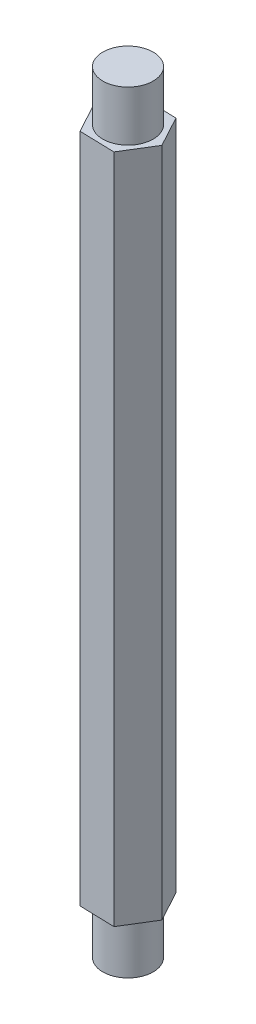
ISO-10303-21;
HEADER;
FILE_DESCRIPTION(('STEP AP214'),'2;1');
FILE_NAME('part.step','',(''),(''),'','','');
FILE_SCHEMA(('AUTOMOTIVE_DESIGN { 1 0 10303 214 1 1 1 1 }'));
ENDSEC;
DATA;
#1=APPLICATION_CONTEXT('core data for automotive mechanical design processes');
#2=APPLICATION_PROTOCOL_DEFINITION('international standard','automotive_design',2000,#1);
#3=PRODUCT_CONTEXT('',#1,'mechanical');
#4=PRODUCT('Part','Part','',(#3));
#5=PRODUCT_RELATED_PRODUCT_CATEGORY('part','',(#4));
#6=PRODUCT_DEFINITION_FORMATION('','',#4);
#7=PRODUCT_DEFINITION_CONTEXT('part definition',#1,'design');
#8=PRODUCT_DEFINITION('design','',#6,#7);
#9=PRODUCT_DEFINITION_SHAPE('','',#8);
#10=(LENGTH_UNIT() NAMED_UNIT(*) SI_UNIT(.MILLI.,.METRE.));
#11=(NAMED_UNIT(*) PLANE_ANGLE_UNIT() SI_UNIT($,.RADIAN.));
#12=(NAMED_UNIT(*) SI_UNIT($,.STERADIAN.) SOLID_ANGLE_UNIT());
#13=UNCERTAINTY_MEASURE_WITH_UNIT(LENGTH_MEASURE(1.E-05),#10,'distance_accuracy_value','');
#14=(GEOMETRIC_REPRESENTATION_CONTEXT(3) GLOBAL_UNCERTAINTY_ASSIGNED_CONTEXT((#13)) GLOBAL_UNIT_ASSIGNED_CONTEXT((#10,
#11,#12)) REPRESENTATION_CONTEXT('',''));
#15=CARTESIAN_POINT('',(0.,0.,0.));
#16=DIRECTION('',(0.,0.,1.));
#17=DIRECTION('',(1.,0.,0.));
#18=AXIS2_PLACEMENT_3D('',#15,#16,#17);
#19=CARTESIAN_POINT('',(0.,43.,0.));
#20=DIRECTION('',(0.,1.,0.));
#21=DIRECTION('',(0.,0.,1.));
#22=AXIS2_PLACEMENT_3D('',#19,#20,#21);
#23=PLANE('',#22);
#24=DIRECTION('',(-0.999619051100166,0.,-0.0275998673475779));
#25=VECTOR('',#24,1.);
#26=CARTESIAN_POINT('',(1.08851435205721,43.,-1.7706316684634));
#27=LINE('',#26,#25);
#28=CARTESIAN_POINT('',(1.08851435205721,43.,-1.7706316684634));
#29=VERTEX_POINT('',#28);
#30=CARTESIAN_POINT('',(-0.989154829605925,43.,-1.8279969154972));
#31=VERTEX_POINT('',#30);
#32=EDGE_CURVE('E130',#29,#31,#27,.T.);
#33=ORIENTED_EDGE('',*,*,#32,.T.);
#34=DIRECTION('',(-0.523711711814166,0.,0.85189555868585));
#35=VECTOR('',#34,1.);
#36=CARTESIAN_POINT('',(-0.989154829605925,43.,-1.8279969154972));
#37=LINE('',#36,#35);
#38=CARTESIAN_POINT('',(-2.07766918166313,43.,-0.0573652470337996));
#39=VERTEX_POINT('',#38);
#40=EDGE_CURVE('E88',#31,#39,#37,.T.);
#41=ORIENTED_EDGE('',*,*,#40,.T.);
#42=DIRECTION('',(0.475907339286,0.,0.879495426033427));
#43=VECTOR('',#42,1.);
#44=CARTESIAN_POINT('',(-2.07766918166313,43.,-0.0573652470337996));
#45=LINE('',#44,#43);
#46=CARTESIAN_POINT('',(-1.0885143520572,43.,1.7706316684634));
#47=VERTEX_POINT('',#46);
#48=EDGE_CURVE('E101',#39,#47,#45,.T.);
#49=ORIENTED_EDGE('',*,*,#48,.T.);
#50=DIRECTION('',(0.999619051100166,0.,0.0275998673475778));
#51=VECTOR('',#50,1.);
#52=CARTESIAN_POINT('',(-1.0885143520572,43.,1.7706316684634));
#53=LINE('',#52,#51);
#54=CARTESIAN_POINT('',(0.989154829605927,43.,1.8279969154972));
#55=VERTEX_POINT('',#54);
#56=EDGE_CURVE('E95',#47,#55,#53,.T.);
#57=ORIENTED_EDGE('',*,*,#56,.T.);
#58=DIRECTION('',(0.523711711814166,0.,-0.85189555868585));
#59=VECTOR('',#58,1.);
#60=CARTESIAN_POINT('',(0.989154829605927,43.,1.8279969154972));
#61=LINE('',#60,#59);
#62=CARTESIAN_POINT('',(2.07766918166313,43.,0.0573652470337994));
#63=VERTEX_POINT('',#62);
#64=EDGE_CURVE('E99',#55,#63,#61,.T.);
#65=ORIENTED_EDGE('',*,*,#64,.T.);
#66=DIRECTION('',(-0.475907339286,0.,-0.879495426033427));
#67=VECTOR('',#66,1.);
#68=CARTESIAN_POINT('',(2.07766918166313,43.,0.0573652470337994));
#69=LINE('',#68,#67);
#70=EDGE_CURVE('E50',#63,#29,#69,.T.);
#71=ORIENTED_EDGE('',*,*,#70,.T.);
#72=EDGE_LOOP('',(#33,#41,#49,#57,#65,#71));
#73=FACE_BOUND('',#72,.T.);
#74=CARTESIAN_POINT('',(0.,43.,0.));
#75=DIRECTION('',(0.,1.,0.));
#76=DIRECTION('',(0.,0.,1.));
#77=AXIS2_PLACEMENT_3D('',#74,#75,#76);
#78=CIRCLE('',#77,1.5);
#79=CARTESIAN_POINT('',(0.,43.,1.5));
#80=VERTEX_POINT('',#79);
#81=EDGE_CURVE('E187',#80,#80,#78,.T.);
#82=ORIENTED_EDGE('',*,*,#81,.F.);
#83=EDGE_LOOP('',(#82));
#84=FACE_BOUND('',#83,.T.);
#85=ADVANCED_FACE('F33',(#73,#84),#23,.T.);
#86=CARTESIAN_POINT('',(0.,3.,0.));
#87=DIRECTION('',(0.,-1.,0.));
#88=DIRECTION('',(0.,0.,-1.));
#89=AXIS2_PLACEMENT_3D('',#86,#87,#88);
#90=CYLINDRICAL_SURFACE('',#89,1.5);
#91=CARTESIAN_POINT('',(0.,3.,0.));
#92=DIRECTION('',(0.,1.,0.));
#93=DIRECTION('',(0.,0.,1.));
#94=AXIS2_PLACEMENT_3D('',#91,#92,#93);
#95=CIRCLE('',#94,1.5);
#96=CARTESIAN_POINT('',(0.,3.,1.5));
#97=VERTEX_POINT('',#96);
#98=EDGE_CURVE('E11',#97,#97,#95,.T.);
#99=ORIENTED_EDGE('',*,*,#98,.F.);
#100=EDGE_LOOP('',(#99));
#101=FACE_BOUND('',#100,.T.);
#102=CARTESIAN_POINT('',(0.,0.,0.));
#103=DIRECTION('',(0.,1.,0.));
#104=DIRECTION('',(0.,0.,1.));
#105=AXIS2_PLACEMENT_3D('',#102,#103,#104);
#106=CIRCLE('',#105,1.5);
#107=CARTESIAN_POINT('',(0.,0.,1.5));
#108=VERTEX_POINT('',#107);
#109=EDGE_CURVE('E37',#108,#108,#106,.T.);
#110=ORIENTED_EDGE('',*,*,#109,.T.);
#111=EDGE_LOOP('',(#110));
#112=FACE_BOUND('',#111,.T.);
#113=ADVANCED_FACE('F35',(#101,#112),#90,.T.);
#114=CARTESIAN_POINT('',(0.,0.,0.));
#115=DIRECTION('',(0.,1.,0.));
#116=DIRECTION('',(0.,0.,1.));
#117=AXIS2_PLACEMENT_3D('',#114,#115,#116);
#118=PLANE('',#117);
#119=ORIENTED_EDGE('',*,*,#109,.F.);
#120=EDGE_LOOP('',(#119));
#121=FACE_BOUND('',#120,.T.);
#122=ADVANCED_FACE('F143',(#121),#118,.F.);
#123=CARTESIAN_POINT('',(0.,3.,0.));
#124=DIRECTION('',(0.,1.,0.));
#125=DIRECTION('',(0.,0.,1.));
#126=AXIS2_PLACEMENT_3D('',#123,#124,#125);
#127=PLANE('',#126);
#128=DIRECTION('',(-0.999619051100166,0.,-0.0275998673475779));
#129=VECTOR('',#128,1.);
#130=CARTESIAN_POINT('',(1.08851435205721,3.,-1.7706316684634));
#131=LINE('',#130,#129);
#132=CARTESIAN_POINT('',(1.08851435205721,3.,-1.7706316684634));
#133=VERTEX_POINT('',#132);
#134=CARTESIAN_POINT('',(-0.989154829605925,3.,-1.8279969154972));
#135=VERTEX_POINT('',#134);
#136=EDGE_CURVE('E119',#133,#135,#131,.T.);
#137=ORIENTED_EDGE('',*,*,#136,.F.);
#138=DIRECTION('',(-0.475907339286,0.,-0.879495426033427));
#139=VECTOR('',#138,1.);
#140=CARTESIAN_POINT('',(2.07766918166313,3.,0.0573652470337994));
#141=LINE('',#140,#139);
#142=CARTESIAN_POINT('',(2.07766918166313,3.,0.0573652470337994));
#143=VERTEX_POINT('',#142);
#144=EDGE_CURVE('E79',#143,#133,#141,.T.);
#145=ORIENTED_EDGE('',*,*,#144,.F.);
#146=DIRECTION('',(0.523711711814166,0.,-0.85189555868585));
#147=VECTOR('',#146,1.);
#148=CARTESIAN_POINT('',(0.989154829605927,3.,1.8279969154972));
#149=LINE('',#148,#147);
#150=CARTESIAN_POINT('',(0.989154829605927,3.,1.8279969154972));
#151=VERTEX_POINT('',#150);
#152=EDGE_CURVE('E73',#151,#143,#149,.T.);
#153=ORIENTED_EDGE('',*,*,#152,.F.);
#154=DIRECTION('',(0.999619051100166,0.,0.0275998673475778));
#155=VECTOR('',#154,1.);
#156=CARTESIAN_POINT('',(-1.0885143520572,3.,1.7706316684634));
#157=LINE('',#156,#155);
#158=CARTESIAN_POINT('',(-1.0885143520572,3.,1.7706316684634));
#159=VERTEX_POINT('',#158);
#160=EDGE_CURVE('E109',#159,#151,#157,.T.);
#161=ORIENTED_EDGE('',*,*,#160,.F.);
#162=DIRECTION('',(0.475907339286,0.,0.879495426033427));
#163=VECTOR('',#162,1.);
#164=CARTESIAN_POINT('',(-2.07766918166313,3.,-0.0573652470337996));
#165=LINE('',#164,#163);
#166=CARTESIAN_POINT('',(-2.07766918166313,3.,-0.0573652470337996));
#167=VERTEX_POINT('',#166);
#168=EDGE_CURVE('E125',#167,#159,#165,.T.);
#169=ORIENTED_EDGE('',*,*,#168,.F.);
#170=DIRECTION('',(-0.523711711814166,0.,0.85189555868585));
#171=VECTOR('',#170,1.);
#172=CARTESIAN_POINT('',(-0.989154829605925,3.,-1.8279969154972));
#173=LINE('',#172,#171);
#174=EDGE_CURVE('E122',#135,#167,#173,.T.);
#175=ORIENTED_EDGE('',*,*,#174,.F.);
#176=EDGE_LOOP('',(#137,#145,#153,#161,#169,#175));
#177=FACE_BOUND('',#176,.T.);
#178=ORIENTED_EDGE('',*,*,#98,.T.);
#179=EDGE_LOOP('',(#178));
#180=FACE_BOUND('',#179,.T.);
#181=ADVANCED_FACE('F145',(#177,#180),#127,.F.);
#182=CARTESIAN_POINT('',(1.08851435205721,43.,-1.7706316684634));
#183=DIRECTION('',(-0.0275998673475779,0.,0.999619051100166));
#184=DIRECTION('',(0.999619051100166,0.,0.0275998673475779));
#185=AXIS2_PLACEMENT_3D('',#182,#183,#184);
#186=PLANE('',#185);
#187=ORIENTED_EDGE('',*,*,#136,.T.);
#188=DIRECTION('',(0.,-1.,0.));
#189=VECTOR('',#188,1.);
#190=CARTESIAN_POINT('',(-0.989154829605925,43.,-1.8279969154972));
#191=LINE('',#190,#189);
#192=EDGE_CURVE('E137',#31,#135,#191,.T.);
#193=ORIENTED_EDGE('',*,*,#192,.F.);
#194=ORIENTED_EDGE('',*,*,#32,.F.);
#195=DIRECTION('',(0.,-1.,0.));
#196=VECTOR('',#195,1.);
#197=CARTESIAN_POINT('',(1.08851435205721,43.,-1.7706316684634));
#198=LINE('',#197,#196);
#199=EDGE_CURVE('E115',#29,#133,#198,.T.);
#200=ORIENTED_EDGE('',*,*,#199,.T.);
#201=EDGE_LOOP('',(#187,#193,#194,#200));
#202=FACE_BOUND('',#201,.T.);
#203=ADVANCED_FACE('F150',(#202),#186,.F.);
#204=CARTESIAN_POINT('',(-0.989154829605925,43.,-1.8279969154972));
#205=DIRECTION('',(0.85189555868585,0.,0.523711711814166));
#206=DIRECTION('',(0.523711711814166,0.,-0.85189555868585));
#207=AXIS2_PLACEMENT_3D('',#204,#205,#206);
#208=PLANE('',#207);
#209=ORIENTED_EDGE('',*,*,#174,.T.);
#210=DIRECTION('',(0.,-1.,0.));
#211=VECTOR('',#210,1.);
#212=CARTESIAN_POINT('',(-2.07766918166313,43.,-0.0573652470337996));
#213=LINE('',#212,#211);
#214=EDGE_CURVE('E134',#39,#167,#213,.T.);
#215=ORIENTED_EDGE('',*,*,#214,.F.);
#216=ORIENTED_EDGE('',*,*,#40,.F.);
#217=ORIENTED_EDGE('',*,*,#192,.T.);
#218=EDGE_LOOP('',(#209,#215,#216,#217));
#219=FACE_BOUND('',#218,.T.);
#220=ADVANCED_FACE('F173',(#219),#208,.F.);
#221=CARTESIAN_POINT('',(-2.07766918166313,43.,-0.0573652470337996));
#222=DIRECTION('',(0.879495426033427,0.,-0.475907339286));
#223=DIRECTION('',(-0.475907339286,0.,-0.879495426033428));
#224=AXIS2_PLACEMENT_3D('',#221,#222,#223);
#225=PLANE('',#224);
#226=ORIENTED_EDGE('',*,*,#168,.T.);
#227=DIRECTION('',(0.,-1.,0.));
#228=VECTOR('',#227,1.);
#229=CARTESIAN_POINT('',(-1.0885143520572,43.,1.7706316684634));
#230=LINE('',#229,#228);
#231=EDGE_CURVE('E110',#47,#159,#230,.T.);
#232=ORIENTED_EDGE('',*,*,#231,.F.);
#233=ORIENTED_EDGE('',*,*,#48,.F.);
#234=ORIENTED_EDGE('',*,*,#214,.T.);
#235=EDGE_LOOP('',(#226,#232,#233,#234));
#236=FACE_BOUND('',#235,.T.);
#237=ADVANCED_FACE('F170',(#236),#225,.F.);
#238=CARTESIAN_POINT('',(-1.0885143520572,43.,1.7706316684634));
#239=DIRECTION('',(0.0275998673475778,0.,-0.999619051100166));
#240=DIRECTION('',(-0.999619051100166,0.,-0.0275998673475778));
#241=AXIS2_PLACEMENT_3D('',#238,#239,#240);
#242=PLANE('',#241);
#243=ORIENTED_EDGE('',*,*,#160,.T.);
#244=DIRECTION('',(0.,-1.,0.));
#245=VECTOR('',#244,1.);
#246=CARTESIAN_POINT('',(0.989154829605927,43.,1.8279969154972));
#247=LINE('',#246,#245);
#248=EDGE_CURVE('E106',#55,#151,#247,.T.);
#249=ORIENTED_EDGE('',*,*,#248,.F.);
#250=ORIENTED_EDGE('',*,*,#56,.F.);
#251=ORIENTED_EDGE('',*,*,#231,.T.);
#252=EDGE_LOOP('',(#243,#249,#250,#251));
#253=FACE_BOUND('',#252,.T.);
#254=ADVANCED_FACE('F107',(#253),#242,.F.);
#255=CARTESIAN_POINT('',(0.989154829605927,43.,1.8279969154972));
#256=DIRECTION('',(-0.85189555868585,0.,-0.523711711814166));
#257=DIRECTION('',(-0.523711711814166,0.,0.85189555868585));
#258=AXIS2_PLACEMENT_3D('',#255,#256,#257);
#259=PLANE('',#258);
#260=ORIENTED_EDGE('',*,*,#152,.T.);
#261=DIRECTION('',(0.,-1.,0.));
#262=VECTOR('',#261,1.);
#263=CARTESIAN_POINT('',(2.07766918166313,43.,0.0573652470337994));
#264=LINE('',#263,#262);
#265=EDGE_CURVE('E111',#63,#143,#264,.T.);
#266=ORIENTED_EDGE('',*,*,#265,.F.);
#267=ORIENTED_EDGE('',*,*,#64,.F.);
#268=ORIENTED_EDGE('',*,*,#248,.T.);
#269=EDGE_LOOP('',(#260,#266,#267,#268));
#270=FACE_BOUND('',#269,.T.);
#271=ADVANCED_FACE('F113',(#270),#259,.F.);
#272=CARTESIAN_POINT('',(2.07766918166313,43.,0.0573652470337994));
#273=DIRECTION('',(-0.879495426033427,0.,0.475907339286));
#274=DIRECTION('',(0.475907339286,0.,0.879495426033428));
#275=AXIS2_PLACEMENT_3D('',#272,#273,#274);
#276=PLANE('',#275);
#277=ORIENTED_EDGE('',*,*,#144,.T.);
#278=ORIENTED_EDGE('',*,*,#199,.F.);
#279=ORIENTED_EDGE('',*,*,#70,.F.);
#280=ORIENTED_EDGE('',*,*,#265,.T.);
#281=EDGE_LOOP('',(#277,#278,#279,#280));
#282=FACE_BOUND('',#281,.T.);
#283=ADVANCED_FACE('F163',(#282),#276,.F.);
#284=CARTESIAN_POINT('',(0.,46.,0.));
#285=DIRECTION('',(0.,-1.,0.));
#286=DIRECTION('',(0.,0.,-1.));
#287=AXIS2_PLACEMENT_3D('',#284,#285,#286);
#288=CYLINDRICAL_SURFACE('',#287,1.5);
#289=CARTESIAN_POINT('',(0.,46.,0.));
#290=DIRECTION('',(0.,1.,0.));
#291=DIRECTION('',(0.,0.,1.));
#292=AXIS2_PLACEMENT_3D('',#289,#290,#291);
#293=CIRCLE('',#292,1.5);
#294=CARTESIAN_POINT('',(0.,46.,1.5));
#295=VERTEX_POINT('',#294);
#296=EDGE_CURVE('E123',#295,#295,#293,.T.);
#297=ORIENTED_EDGE('',*,*,#296,.F.);
#298=EDGE_LOOP('',(#297));
#299=FACE_BOUND('',#298,.T.);
#300=ORIENTED_EDGE('',*,*,#81,.T.);
#301=EDGE_LOOP('',(#300));
#302=FACE_BOUND('',#301,.T.);
#303=ADVANCED_FACE('F160',(#299,#302),#288,.T.);
#304=CARTESIAN_POINT('',(0.,46.,0.));
#305=DIRECTION('',(0.,1.,0.));
#306=DIRECTION('',(0.,0.,1.));
#307=AXIS2_PLACEMENT_3D('',#304,#305,#306);
#308=PLANE('',#307);
#309=ORIENTED_EDGE('',*,*,#296,.T.);
#310=EDGE_LOOP('',(#309));
#311=FACE_BOUND('',#310,.T.);
#312=ADVANCED_FACE('F193',(#311),#308,.T.);
#313=CLOSED_SHELL('',(#85,#113,#122,#181,#203,#220,#237,#254,#271,#283,#303,#312));
#314=MANIFOLD_SOLID_BREP('B2',#313);
#315=ADVANCED_BREP_SHAPE_REPRESENTATION('',(#18,#314),#14);
#316=SHAPE_DEFINITION_REPRESENTATION(#9,#315);
ENDSEC;
END-ISO-10303-21;
